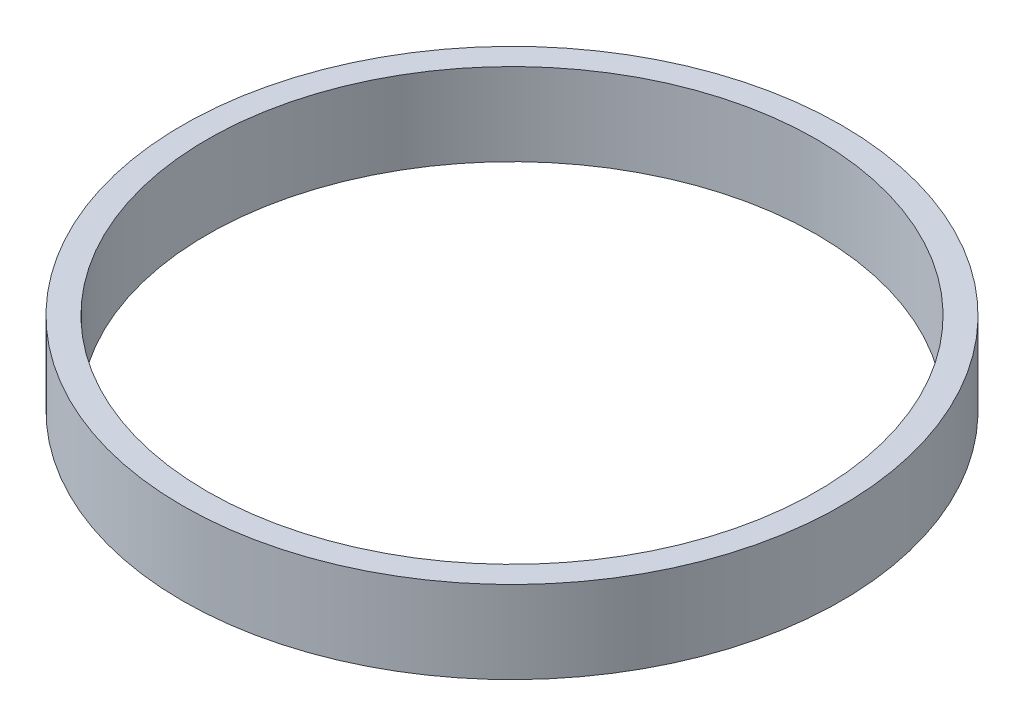
ISO-10303-21;
HEADER;
FILE_DESCRIPTION(('STEP AP214'),'2;1');
FILE_NAME('part.step','',(''),(''),'','','');
FILE_SCHEMA(('AUTOMOTIVE_DESIGN { 1 0 10303 214 1 1 1 1 }'));
ENDSEC;
DATA;
#1=APPLICATION_CONTEXT('core data for automotive mechanical design processes');
#2=APPLICATION_PROTOCOL_DEFINITION('international standard','automotive_design',2000,#1);
#3=PRODUCT_CONTEXT('',#1,'mechanical');
#4=PRODUCT('Part','Part','',(#3));
#5=PRODUCT_RELATED_PRODUCT_CATEGORY('part','',(#4));
#6=PRODUCT_DEFINITION_FORMATION('','',#4);
#7=PRODUCT_DEFINITION_CONTEXT('part definition',#1,'design');
#8=PRODUCT_DEFINITION('design','',#6,#7);
#9=PRODUCT_DEFINITION_SHAPE('','',#8);
#10=(LENGTH_UNIT() NAMED_UNIT(*) SI_UNIT(.MILLI.,.METRE.));
#11=(NAMED_UNIT(*) PLANE_ANGLE_UNIT() SI_UNIT($,.RADIAN.));
#12=(NAMED_UNIT(*) SI_UNIT($,.STERADIAN.) SOLID_ANGLE_UNIT());
#13=UNCERTAINTY_MEASURE_WITH_UNIT(LENGTH_MEASURE(1.E-05),#10,'distance_accuracy_value','');
#14=(GEOMETRIC_REPRESENTATION_CONTEXT(3) GLOBAL_UNCERTAINTY_ASSIGNED_CONTEXT((#13)) GLOBAL_UNIT_ASSIGNED_CONTEXT((#10,
#11,#12)) REPRESENTATION_CONTEXT('',''));
#15=CARTESIAN_POINT('',(0.,0.,0.));
#16=DIRECTION('',(0.,0.,1.));
#17=DIRECTION('',(1.,0.,0.));
#18=AXIS2_PLACEMENT_3D('',#15,#16,#17);
#19=CARTESIAN_POINT('',(0.,12.7,0.));
#20=DIRECTION('',(0.,-1.,0.));
#21=DIRECTION('',(0.,0.,-1.));
#22=AXIS2_PLACEMENT_3D('',#19,#20,#21);
#23=CYLINDRICAL_SURFACE('',#22,93.98);
#24=CARTESIAN_POINT('',(0.,-12.7,0.));
#25=DIRECTION('',(0.,-1.,0.));
#26=DIRECTION('',(0.,0.,-1.));
#27=AXIS2_PLACEMENT_3D('',#24,#25,#26);
#28=CIRCLE('',#27,93.98);
#29=CARTESIAN_POINT('',(0.,-12.7,-93.98));
#30=VERTEX_POINT('',#29);
#31=EDGE_CURVE('E27',#30,#30,#28,.T.);
#32=ORIENTED_EDGE('',*,*,#31,.T.);
#33=EDGE_LOOP('',(#32));
#34=FACE_BOUND('',#33,.T.);
#35=CARTESIAN_POINT('',(0.,12.7,0.));
#36=DIRECTION('',(0.,-1.,0.));
#37=DIRECTION('',(0.,0.,-1.));
#38=AXIS2_PLACEMENT_3D('',#35,#36,#37);
#39=CIRCLE('',#38,93.98);
#40=CARTESIAN_POINT('',(0.,12.7,-93.98));
#41=VERTEX_POINT('',#40);
#42=EDGE_CURVE('E18',#41,#41,#39,.T.);
#43=ORIENTED_EDGE('',*,*,#42,.F.);
#44=EDGE_LOOP('',(#43));
#45=FACE_BOUND('',#44,.T.);
#46=ADVANCED_FACE('F15',(#34,#45),#23,.F.);
#47=CARTESIAN_POINT('',(0.,12.7,0.));
#48=DIRECTION('',(0.,1.,0.));
#49=DIRECTION('',(0.,0.,1.));
#50=AXIS2_PLACEMENT_3D('',#47,#48,#49);
#51=PLANE('',#50);
#52=ORIENTED_EDGE('',*,*,#42,.T.);
#53=EDGE_LOOP('',(#52));
#54=FACE_BOUND('',#53,.T.);
#55=CARTESIAN_POINT('',(0.,12.7,0.));
#56=DIRECTION('',(0.,-1.,0.));
#57=DIRECTION('',(0.,0.,-1.));
#58=AXIS2_PLACEMENT_3D('',#55,#56,#57);
#59=CIRCLE('',#58,101.6);
#60=CARTESIAN_POINT('',(0.,12.7,-101.6));
#61=VERTEX_POINT('',#60);
#62=EDGE_CURVE('E22',#61,#61,#59,.T.);
#63=ORIENTED_EDGE('',*,*,#62,.F.);
#64=EDGE_LOOP('',(#63));
#65=FACE_BOUND('',#64,.T.);
#66=ADVANCED_FACE('F35',(#54,#65),#51,.T.);
#67=CARTESIAN_POINT('',(0.,-12.7,0.));
#68=DIRECTION('',(0.,1.,0.));
#69=DIRECTION('',(0.,0.,1.));
#70=AXIS2_PLACEMENT_3D('',#67,#68,#69);
#71=PLANE('',#70);
#72=ORIENTED_EDGE('',*,*,#31,.F.);
#73=EDGE_LOOP('',(#72));
#74=FACE_BOUND('',#73,.T.);
#75=CARTESIAN_POINT('',(0.,-12.7,0.));
#76=DIRECTION('',(0.,-1.,0.));
#77=DIRECTION('',(0.,0.,-1.));
#78=AXIS2_PLACEMENT_3D('',#75,#76,#77);
#79=CIRCLE('',#78,101.6);
#80=CARTESIAN_POINT('',(0.,-12.7,-101.6));
#81=VERTEX_POINT('',#80);
#82=EDGE_CURVE('E10',#81,#81,#79,.F.);
#83=ORIENTED_EDGE('',*,*,#82,.F.);
#84=EDGE_LOOP('',(#83));
#85=FACE_BOUND('',#84,.T.);
#86=ADVANCED_FACE('F43',(#74,#85),#71,.F.);
#87=CARTESIAN_POINT('',(0.,12.7,0.));
#88=DIRECTION('',(0.,-1.,0.));
#89=DIRECTION('',(0.,0.,-1.));
#90=AXIS2_PLACEMENT_3D('',#87,#88,#89);
#91=CYLINDRICAL_SURFACE('',#90,101.6);
#92=ORIENTED_EDGE('',*,*,#82,.T.);
#93=EDGE_LOOP('',(#92));
#94=FACE_BOUND('',#93,.T.);
#95=ORIENTED_EDGE('',*,*,#62,.T.);
#96=EDGE_LOOP('',(#95));
#97=FACE_BOUND('',#96,.T.);
#98=ADVANCED_FACE('F44',(#94,#97),#91,.T.);
#99=CLOSED_SHELL('',(#46,#66,#86,#98));
#100=MANIFOLD_SOLID_BREP('B1',#99);
#101=ADVANCED_BREP_SHAPE_REPRESENTATION('',(#18,#100),#14);
#102=SHAPE_DEFINITION_REPRESENTATION(#9,#101);
ENDSEC;
END-ISO-10303-21;
